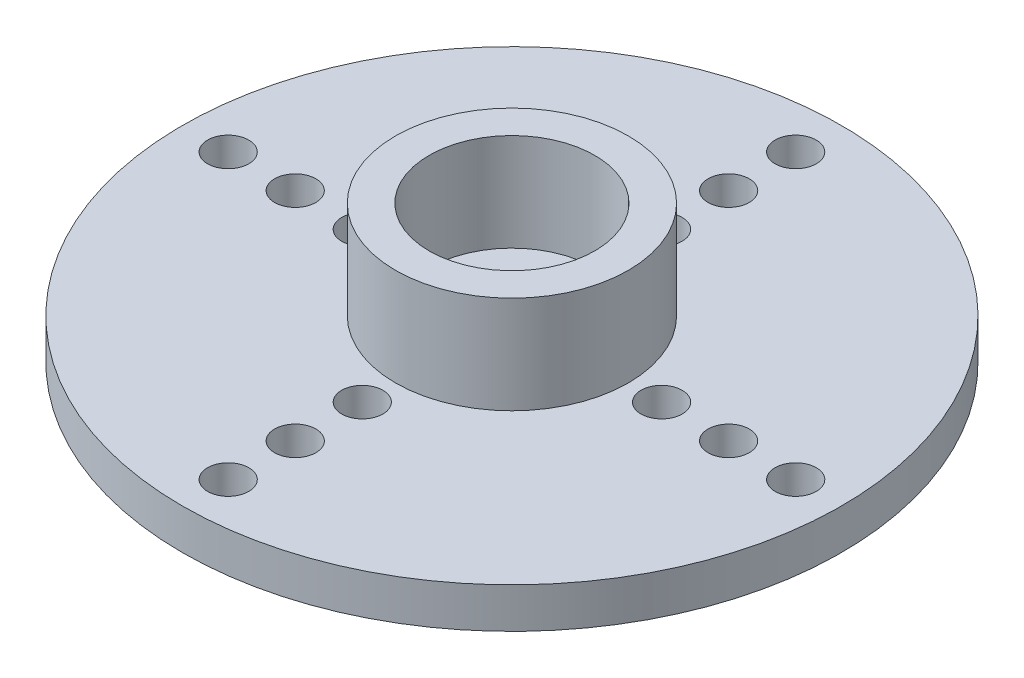
ISO-10303-21;
HEADER;
FILE_DESCRIPTION(('STEP AP214'),'2;1');
FILE_NAME('part.step','',(''),(''),'','','');
FILE_SCHEMA(('AUTOMOTIVE_DESIGN { 1 0 10303 214 1 1 1 1 }'));
ENDSEC;
DATA;
#1=APPLICATION_CONTEXT('core data for automotive mechanical design processes');
#2=APPLICATION_PROTOCOL_DEFINITION('international standard','automotive_design',2000,#1);
#3=PRODUCT_CONTEXT('',#1,'mechanical');
#4=PRODUCT('Part','Part','',(#3));
#5=PRODUCT_RELATED_PRODUCT_CATEGORY('part','',(#4));
#6=PRODUCT_DEFINITION_FORMATION('','',#4);
#7=PRODUCT_DEFINITION_CONTEXT('part definition',#1,'design');
#8=PRODUCT_DEFINITION('design','',#6,#7);
#9=PRODUCT_DEFINITION_SHAPE('','',#8);
#10=(LENGTH_UNIT() NAMED_UNIT(*) SI_UNIT(.MILLI.,.METRE.));
#11=(NAMED_UNIT(*) PLANE_ANGLE_UNIT() SI_UNIT($,.RADIAN.));
#12=(NAMED_UNIT(*) SI_UNIT($,.STERADIAN.) SOLID_ANGLE_UNIT());
#13=UNCERTAINTY_MEASURE_WITH_UNIT(LENGTH_MEASURE(1.E-05),#10,'distance_accuracy_value','');
#14=(GEOMETRIC_REPRESENTATION_CONTEXT(3) GLOBAL_UNCERTAINTY_ASSIGNED_CONTEXT((#13)) GLOBAL_UNIT_ASSIGNED_CONTEXT((#10,
#11,#12)) REPRESENTATION_CONTEXT('',''));
#15=CARTESIAN_POINT('',(0.,0.,0.));
#16=DIRECTION('',(0.,0.,1.));
#17=DIRECTION('',(1.,0.,0.));
#18=AXIS2_PLACEMENT_3D('',#15,#16,#17);
#19=CARTESIAN_POINT('',(0.,1.2192,0.));
#20=DIRECTION('',(0.,1.,0.));
#21=DIRECTION('',(0.,0.,1.));
#22=AXIS2_PLACEMENT_3D('',#19,#20,#21);
#23=PLANE('',#22);
#24=CARTESIAN_POINT('',(0.,1.2192,4.5212));
#25=DIRECTION('',(0.,1.,0.));
#26=DIRECTION('',(0.,0.,-1.));
#27=AXIS2_PLACEMENT_3D('',#24,#25,#26);
#28=CIRCLE('',#27,0.622300000000001);
#29=CARTESIAN_POINT('',(0.,1.2192,3.8989));
#30=VERTEX_POINT('',#29);
#31=EDGE_CURVE('E130',#30,#30,#28,.T.);
#32=ORIENTED_EDGE('',*,*,#31,.F.);
#33=EDGE_LOOP('',(#32));
#34=FACE_BOUND('',#33,.T.);
#35=CARTESIAN_POINT('',(0.,1.2192,6.54685));
#36=DIRECTION('',(0.,1.,0.));
#37=DIRECTION('',(0.,0.,-1.));
#38=AXIS2_PLACEMENT_3D('',#35,#36,#37);
#39=CIRCLE('',#38,0.622300000000001);
#40=CARTESIAN_POINT('',(0.,1.2192,5.92455));
#41=VERTEX_POINT('',#40);
#42=EDGE_CURVE('E124',#41,#41,#39,.T.);
#43=ORIENTED_EDGE('',*,*,#42,.F.);
#44=EDGE_LOOP('',(#43));
#45=FACE_BOUND('',#44,.T.);
#46=CARTESIAN_POINT('',(0.,1.2192,8.5725));
#47=DIRECTION('',(0.,1.,0.));
#48=DIRECTION('',(0.,0.,-1.));
#49=AXIS2_PLACEMENT_3D('',#46,#47,#48);
#50=CIRCLE('',#49,0.622299999999999);
#51=CARTESIAN_POINT('',(0.,1.2192,7.9502));
#52=VERTEX_POINT('',#51);
#53=EDGE_CURVE('E118',#52,#52,#50,.T.);
#54=ORIENTED_EDGE('',*,*,#53,.F.);
#55=EDGE_LOOP('',(#54));
#56=FACE_BOUND('',#55,.T.);
#57=CARTESIAN_POINT('',(0.,1.2192,-8.5725));
#58=DIRECTION('',(0.,1.,0.));
#59=DIRECTION('',(0.,0.,1.));
#60=AXIS2_PLACEMENT_3D('',#57,#58,#59);
#61=CIRCLE('',#60,0.622299999999999);
#62=CARTESIAN_POINT('',(0.,1.2192,-7.9502));
#63=VERTEX_POINT('',#62);
#64=EDGE_CURVE('E112',#63,#63,#61,.T.);
#65=ORIENTED_EDGE('',*,*,#64,.F.);
#66=EDGE_LOOP('',(#65));
#67=FACE_BOUND('',#66,.T.);
#68=CARTESIAN_POINT('',(0.,1.2192,-6.54685));
#69=DIRECTION('',(0.,1.,0.));
#70=DIRECTION('',(0.,0.,1.));
#71=AXIS2_PLACEMENT_3D('',#68,#69,#70);
#72=CIRCLE('',#71,0.6223);
#73=CARTESIAN_POINT('',(0.,1.2192,-5.92455));
#74=VERTEX_POINT('',#73);
#75=EDGE_CURVE('E106',#74,#74,#72,.T.);
#76=ORIENTED_EDGE('',*,*,#75,.F.);
#77=EDGE_LOOP('',(#76));
#78=FACE_BOUND('',#77,.T.);
#79=CARTESIAN_POINT('',(0.,1.2192,-4.5212));
#80=DIRECTION('',(0.,1.,0.));
#81=DIRECTION('',(0.,0.,1.));
#82=AXIS2_PLACEMENT_3D('',#79,#80,#81);
#83=CIRCLE('',#82,0.622300000000001);
#84=CARTESIAN_POINT('',(0.,1.2192,-3.8989));
#85=VERTEX_POINT('',#84);
#86=EDGE_CURVE('E100',#85,#85,#83,.T.);
#87=ORIENTED_EDGE('',*,*,#86,.F.);
#88=EDGE_LOOP('',(#87));
#89=FACE_BOUND('',#88,.T.);
#90=CARTESIAN_POINT('',(4.5212,1.2192,0.));
#91=DIRECTION('',(0.,1.,0.));
#92=DIRECTION('',(0.,0.,-1.));
#93=AXIS2_PLACEMENT_3D('',#90,#91,#92);
#94=CIRCLE('',#93,0.6223);
#95=CARTESIAN_POINT('',(4.5212,1.2192,-0.6223));
#96=VERTEX_POINT('',#95);
#97=EDGE_CURVE('E94',#96,#96,#94,.T.);
#98=ORIENTED_EDGE('',*,*,#97,.F.);
#99=EDGE_LOOP('',(#98));
#100=FACE_BOUND('',#99,.T.);
#101=CARTESIAN_POINT('',(6.54685,1.2192,0.));
#102=DIRECTION('',(0.,1.,0.));
#103=DIRECTION('',(0.,0.,-1.));
#104=AXIS2_PLACEMENT_3D('',#101,#102,#103);
#105=CIRCLE('',#104,0.6223);
#106=CARTESIAN_POINT('',(6.54685,1.2192,-0.622300000000001));
#107=VERTEX_POINT('',#106);
#108=EDGE_CURVE('E88',#107,#107,#105,.T.);
#109=ORIENTED_EDGE('',*,*,#108,.F.);
#110=EDGE_LOOP('',(#109));
#111=FACE_BOUND('',#110,.T.);
#112=CARTESIAN_POINT('',(8.5725,1.2192,0.));
#113=DIRECTION('',(0.,1.,0.));
#114=DIRECTION('',(0.,0.,-1.));
#115=AXIS2_PLACEMENT_3D('',#112,#113,#114);
#116=CIRCLE('',#115,0.622299999999999);
#117=CARTESIAN_POINT('',(8.5725,1.2192,-0.622300000000006));
#118=VERTEX_POINT('',#117);
#119=EDGE_CURVE('E82',#118,#118,#116,.T.);
#120=ORIENTED_EDGE('',*,*,#119,.F.);
#121=EDGE_LOOP('',(#120));
#122=FACE_BOUND('',#121,.T.);
#123=CARTESIAN_POINT('',(-8.5725,1.2192,0.));
#124=DIRECTION('',(0.,1.,0.));
#125=DIRECTION('',(0.,0.,1.));
#126=AXIS2_PLACEMENT_3D('',#123,#124,#125);
#127=CIRCLE('',#126,0.622299999999999);
#128=CARTESIAN_POINT('',(-8.5725,1.2192,0.6223));
#129=VERTEX_POINT('',#128);
#130=EDGE_CURVE('E76',#129,#129,#127,.T.);
#131=ORIENTED_EDGE('',*,*,#130,.F.);
#132=EDGE_LOOP('',(#131));
#133=FACE_BOUND('',#132,.T.);
#134=CARTESIAN_POINT('',(-6.54685,1.2192,0.));
#135=DIRECTION('',(0.,1.,0.));
#136=DIRECTION('',(0.,0.,1.));
#137=AXIS2_PLACEMENT_3D('',#134,#135,#136);
#138=CIRCLE('',#137,0.6223);
#139=CARTESIAN_POINT('',(-6.54685,1.2192,0.6223));
#140=VERTEX_POINT('',#139);
#141=EDGE_CURVE('E70',#140,#140,#138,.T.);
#142=ORIENTED_EDGE('',*,*,#141,.F.);
#143=EDGE_LOOP('',(#142));
#144=FACE_BOUND('',#143,.T.);
#145=CARTESIAN_POINT('',(-4.5212,1.2192,0.));
#146=DIRECTION('',(0.,1.,0.));
#147=DIRECTION('',(0.,0.,1.));
#148=AXIS2_PLACEMENT_3D('',#145,#146,#147);
#149=CIRCLE('',#148,0.6223);
#150=CARTESIAN_POINT('',(-4.5212,1.2192,0.6223));
#151=VERTEX_POINT('',#150);
#152=EDGE_CURVE('E64',#151,#151,#149,.T.);
#153=ORIENTED_EDGE('',*,*,#152,.F.);
#154=EDGE_LOOP('',(#153));
#155=FACE_BOUND('',#154,.T.);
#156=CARTESIAN_POINT('',(0.,1.2192,0.));
#157=DIRECTION('',(0.,1.,0.));
#158=DIRECTION('',(0.,0.,1.));
#159=AXIS2_PLACEMENT_3D('',#156,#157,#158);
#160=CIRCLE('',#159,9.9568);
#161=CARTESIAN_POINT('',(0.,1.2192,9.9568));
#162=VERTEX_POINT('',#161);
#163=EDGE_CURVE('E38',#162,#162,#160,.T.);
#164=ORIENTED_EDGE('',*,*,#163,.T.);
#165=EDGE_LOOP('',(#164));
#166=FACE_BOUND('',#165,.T.);
#167=CARTESIAN_POINT('',(0.,1.2192,0.));
#168=DIRECTION('',(0.,1.,0.));
#169=DIRECTION('',(0.,0.,1.));
#170=AXIS2_PLACEMENT_3D('',#167,#168,#169);
#171=CIRCLE('',#170,3.5179);
#172=CARTESIAN_POINT('',(0.,1.2192,3.5179));
#173=VERTEX_POINT('',#172);
#174=EDGE_CURVE('E49',#173,#173,#171,.T.);
#175=ORIENTED_EDGE('',*,*,#174,.F.);
#176=EDGE_LOOP('',(#175));
#177=FACE_BOUND('',#176,.T.);
#178=ADVANCED_FACE('F31',(#34,#45,#56,#67,#78,#89,#100,#111,#122,#133,#144,#155,#166,#177),#23,.T.);
#179=CARTESIAN_POINT('',(0.,1.2192,0.));
#180=DIRECTION('',(0.,-1.,0.));
#181=DIRECTION('',(0.,0.,-1.));
#182=AXIS2_PLACEMENT_3D('',#179,#180,#181);
#183=CYLINDRICAL_SURFACE('',#182,9.9568);
#184=ORIENTED_EDGE('',*,*,#163,.F.);
#185=EDGE_LOOP('',(#184));
#186=FACE_BOUND('',#185,.T.);
#187=CARTESIAN_POINT('',(0.,0.,0.));
#188=DIRECTION('',(0.,1.,0.));
#189=DIRECTION('',(0.,0.,1.));
#190=AXIS2_PLACEMENT_3D('',#187,#188,#189);
#191=CIRCLE('',#190,9.9568);
#192=CARTESIAN_POINT('',(0.,0.,9.9568));
#193=VERTEX_POINT('',#192);
#194=EDGE_CURVE('E42',#193,#193,#191,.T.);
#195=ORIENTED_EDGE('',*,*,#194,.T.);
#196=EDGE_LOOP('',(#195));
#197=FACE_BOUND('',#196,.T.);
#198=ADVANCED_FACE('F33',(#186,#197),#183,.T.);
#199=CARTESIAN_POINT('',(0.,0.,0.));
#200=DIRECTION('',(0.,1.,0.));
#201=DIRECTION('',(0.,0.,1.));
#202=AXIS2_PLACEMENT_3D('',#199,#200,#201);
#203=PLANE('',#202);
#204=CARTESIAN_POINT('',(0.,0.,4.5212));
#205=DIRECTION('',(0.,1.,0.));
#206=DIRECTION('',(0.,0.,-1.));
#207=AXIS2_PLACEMENT_3D('',#204,#205,#206);
#208=CIRCLE('',#207,0.622300000000001);
#209=CARTESIAN_POINT('',(0.,0.,3.8989));
#210=VERTEX_POINT('',#209);
#211=EDGE_CURVE('E127',#210,#210,#208,.T.);
#212=ORIENTED_EDGE('',*,*,#211,.T.);
#213=EDGE_LOOP('',(#212));
#214=FACE_BOUND('',#213,.T.);
#215=CARTESIAN_POINT('',(0.,0.,6.54685));
#216=DIRECTION('',(0.,1.,0.));
#217=DIRECTION('',(0.,0.,-1.));
#218=AXIS2_PLACEMENT_3D('',#215,#216,#217);
#219=CIRCLE('',#218,0.622300000000001);
#220=CARTESIAN_POINT('',(0.,0.,5.92455));
#221=VERTEX_POINT('',#220);
#222=EDGE_CURVE('E121',#221,#221,#219,.T.);
#223=ORIENTED_EDGE('',*,*,#222,.T.);
#224=EDGE_LOOP('',(#223));
#225=FACE_BOUND('',#224,.T.);
#226=CARTESIAN_POINT('',(0.,0.,8.5725));
#227=DIRECTION('',(0.,1.,0.));
#228=DIRECTION('',(0.,0.,-1.));
#229=AXIS2_PLACEMENT_3D('',#226,#227,#228);
#230=CIRCLE('',#229,0.622299999999999);
#231=CARTESIAN_POINT('',(0.,0.,7.9502));
#232=VERTEX_POINT('',#231);
#233=EDGE_CURVE('E115',#232,#232,#230,.T.);
#234=ORIENTED_EDGE('',*,*,#233,.T.);
#235=EDGE_LOOP('',(#234));
#236=FACE_BOUND('',#235,.T.);
#237=CARTESIAN_POINT('',(0.,0.,-8.5725));
#238=DIRECTION('',(0.,1.,0.));
#239=DIRECTION('',(0.,0.,1.));
#240=AXIS2_PLACEMENT_3D('',#237,#238,#239);
#241=CIRCLE('',#240,0.622299999999999);
#242=CARTESIAN_POINT('',(0.,0.,-7.9502));
#243=VERTEX_POINT('',#242);
#244=EDGE_CURVE('E109',#243,#243,#241,.T.);
#245=ORIENTED_EDGE('',*,*,#244,.T.);
#246=EDGE_LOOP('',(#245));
#247=FACE_BOUND('',#246,.T.);
#248=CARTESIAN_POINT('',(0.,0.,-6.54685));
#249=DIRECTION('',(0.,1.,0.));
#250=DIRECTION('',(0.,0.,1.));
#251=AXIS2_PLACEMENT_3D('',#248,#249,#250);
#252=CIRCLE('',#251,0.6223);
#253=CARTESIAN_POINT('',(0.,0.,-5.92455));
#254=VERTEX_POINT('',#253);
#255=EDGE_CURVE('E103',#254,#254,#252,.T.);
#256=ORIENTED_EDGE('',*,*,#255,.T.);
#257=EDGE_LOOP('',(#256));
#258=FACE_BOUND('',#257,.T.);
#259=CARTESIAN_POINT('',(0.,0.,-4.5212));
#260=DIRECTION('',(0.,1.,0.));
#261=DIRECTION('',(0.,0.,1.));
#262=AXIS2_PLACEMENT_3D('',#259,#260,#261);
#263=CIRCLE('',#262,0.622300000000001);
#264=CARTESIAN_POINT('',(0.,0.,-3.8989));
#265=VERTEX_POINT('',#264);
#266=EDGE_CURVE('E97',#265,#265,#263,.T.);
#267=ORIENTED_EDGE('',*,*,#266,.T.);
#268=EDGE_LOOP('',(#267));
#269=FACE_BOUND('',#268,.T.);
#270=CARTESIAN_POINT('',(4.5212,0.,0.));
#271=DIRECTION('',(0.,1.,0.));
#272=DIRECTION('',(0.,0.,-1.));
#273=AXIS2_PLACEMENT_3D('',#270,#271,#272);
#274=CIRCLE('',#273,0.6223);
#275=CARTESIAN_POINT('',(4.5212,0.,-0.6223));
#276=VERTEX_POINT('',#275);
#277=EDGE_CURVE('E91',#276,#276,#274,.T.);
#278=ORIENTED_EDGE('',*,*,#277,.T.);
#279=EDGE_LOOP('',(#278));
#280=FACE_BOUND('',#279,.T.);
#281=CARTESIAN_POINT('',(6.54685,0.,0.));
#282=DIRECTION('',(0.,1.,0.));
#283=DIRECTION('',(0.,0.,-1.));
#284=AXIS2_PLACEMENT_3D('',#281,#282,#283);
#285=CIRCLE('',#284,0.6223);
#286=CARTESIAN_POINT('',(6.54685,0.,-0.622300000000001));
#287=VERTEX_POINT('',#286);
#288=EDGE_CURVE('E85',#287,#287,#285,.T.);
#289=ORIENTED_EDGE('',*,*,#288,.T.);
#290=EDGE_LOOP('',(#289));
#291=FACE_BOUND('',#290,.T.);
#292=CARTESIAN_POINT('',(8.5725,0.,0.));
#293=DIRECTION('',(0.,1.,0.));
#294=DIRECTION('',(0.,0.,-1.));
#295=AXIS2_PLACEMENT_3D('',#292,#293,#294);
#296=CIRCLE('',#295,0.622299999999999);
#297=CARTESIAN_POINT('',(8.5725,0.,-0.622300000000006));
#298=VERTEX_POINT('',#297);
#299=EDGE_CURVE('E79',#298,#298,#296,.T.);
#300=ORIENTED_EDGE('',*,*,#299,.T.);
#301=EDGE_LOOP('',(#300));
#302=FACE_BOUND('',#301,.T.);
#303=CARTESIAN_POINT('',(-8.5725,0.,0.));
#304=DIRECTION('',(0.,1.,0.));
#305=DIRECTION('',(0.,0.,1.));
#306=AXIS2_PLACEMENT_3D('',#303,#304,#305);
#307=CIRCLE('',#306,0.622299999999999);
#308=CARTESIAN_POINT('',(-8.5725,0.,0.6223));
#309=VERTEX_POINT('',#308);
#310=EDGE_CURVE('E73',#309,#309,#307,.T.);
#311=ORIENTED_EDGE('',*,*,#310,.T.);
#312=EDGE_LOOP('',(#311));
#313=FACE_BOUND('',#312,.T.);
#314=CARTESIAN_POINT('',(-6.54685,0.,0.));
#315=DIRECTION('',(0.,1.,0.));
#316=DIRECTION('',(0.,0.,1.));
#317=AXIS2_PLACEMENT_3D('',#314,#315,#316);
#318=CIRCLE('',#317,0.6223);
#319=CARTESIAN_POINT('',(-6.54685,0.,0.6223));
#320=VERTEX_POINT('',#319);
#321=EDGE_CURVE('E67',#320,#320,#318,.T.);
#322=ORIENTED_EDGE('',*,*,#321,.T.);
#323=EDGE_LOOP('',(#322));
#324=FACE_BOUND('',#323,.T.);
#325=CARTESIAN_POINT('',(-4.5212,0.,0.));
#326=DIRECTION('',(0.,1.,0.));
#327=DIRECTION('',(0.,0.,1.));
#328=AXIS2_PLACEMENT_3D('',#325,#326,#327);
#329=CIRCLE('',#328,0.6223);
#330=CARTESIAN_POINT('',(-4.5212,0.,0.6223));
#331=VERTEX_POINT('',#330);
#332=EDGE_CURVE('E61',#331,#331,#329,.T.);
#333=ORIENTED_EDGE('',*,*,#332,.T.);
#334=EDGE_LOOP('',(#333));
#335=FACE_BOUND('',#334,.T.);
#336=CARTESIAN_POINT('',(0.,0.,0.));
#337=DIRECTION('',(0.,1.,0.));
#338=DIRECTION('',(0.,0.,1.));
#339=AXIS2_PLACEMENT_3D('',#336,#337,#338);
#340=CIRCLE('',#339,1.0795);
#341=CARTESIAN_POINT('',(0.,0.,1.0795));
#342=VERTEX_POINT('',#341);
#343=EDGE_CURVE('E57',#342,#342,#340,.T.);
#344=ORIENTED_EDGE('',*,*,#343,.T.);
#345=EDGE_LOOP('',(#344));
#346=FACE_BOUND('',#345,.T.);
#347=ORIENTED_EDGE('',*,*,#194,.F.);
#348=EDGE_LOOP('',(#347));
#349=FACE_BOUND('',#348,.T.);
#350=ADVANCED_FACE('F136',(#214,#225,#236,#247,#258,#269,#280,#291,#302,#313,#324,#335,#346,
#349),#203,.F.);
#351=CARTESIAN_POINT('',(0.,4.1656,0.));
#352=DIRECTION('',(0.,1.,0.));
#353=DIRECTION('',(0.,0.,1.));
#354=AXIS2_PLACEMENT_3D('',#351,#352,#353);
#355=PLANE('',#354);
#356=CARTESIAN_POINT('',(0.,4.1656,0.));
#357=DIRECTION('',(0.,1.,0.));
#358=DIRECTION('',(0.,0.,1.));
#359=AXIS2_PLACEMENT_3D('',#356,#357,#358);
#360=CIRCLE('',#359,3.5179);
#361=CARTESIAN_POINT('',(0.,4.1656,3.5179));
#362=VERTEX_POINT('',#361);
#363=EDGE_CURVE('E47',#362,#362,#360,.T.);
#364=ORIENTED_EDGE('',*,*,#363,.T.);
#365=EDGE_LOOP('',(#364));
#366=FACE_BOUND('',#365,.T.);
#367=CARTESIAN_POINT('',(0.,4.1656,0.));
#368=DIRECTION('',(0.,1.,0.));
#369=DIRECTION('',(0.,0.,1.));
#370=AXIS2_PLACEMENT_3D('',#367,#368,#369);
#371=CIRCLE('',#370,2.5019);
#372=CARTESIAN_POINT('',(0.,4.1656,2.5019));
#373=VERTEX_POINT('',#372);
#374=EDGE_CURVE('E52',#373,#373,#371,.T.);
#375=ORIENTED_EDGE('',*,*,#374,.F.);
#376=EDGE_LOOP('',(#375));
#377=FACE_BOUND('',#376,.T.);
#378=ADVANCED_FACE('F177',(#366,#377),#355,.T.);
#379=CARTESIAN_POINT('',(0.,4.1656,0.));
#380=DIRECTION('',(0.,-1.,0.));
#381=DIRECTION('',(0.,0.,-1.));
#382=AXIS2_PLACEMENT_3D('',#379,#380,#381);
#383=CYLINDRICAL_SURFACE('',#382,3.5179);
#384=ORIENTED_EDGE('',*,*,#363,.F.);
#385=EDGE_LOOP('',(#384));
#386=FACE_BOUND('',#385,.T.);
#387=ORIENTED_EDGE('',*,*,#174,.T.);
#388=EDGE_LOOP('',(#387));
#389=FACE_BOUND('',#388,.T.);
#390=ADVANCED_FACE('F174',(#386,#389),#383,.T.);
#391=CARTESIAN_POINT('',(0.,4.1656,0.));
#392=DIRECTION('',(0.,-1.,0.));
#393=DIRECTION('',(0.,0.,-1.));
#394=AXIS2_PLACEMENT_3D('',#391,#392,#393);
#395=CYLINDRICAL_SURFACE('',#394,2.5019);
#396=ORIENTED_EDGE('',*,*,#374,.T.);
#397=EDGE_LOOP('',(#396));
#398=FACE_BOUND('',#397,.T.);
#399=CARTESIAN_POINT('',(0.,1.2192,0.));
#400=DIRECTION('',(0.,1.,0.));
#401=DIRECTION('',(0.,0.,1.));
#402=AXIS2_PLACEMENT_3D('',#399,#400,#401);
#403=CIRCLE('',#402,2.5019);
#404=CARTESIAN_POINT('',(0.,1.2192,2.5019));
#405=VERTEX_POINT('',#404);
#406=EDGE_CURVE('E10',#405,#405,#403,.F.);
#407=ORIENTED_EDGE('',*,*,#406,.T.);
#408=EDGE_LOOP('',(#407));
#409=FACE_BOUND('',#408,.T.);
#410=ADVANCED_FACE('F176',(#398,#409),#395,.F.);
#411=CARTESIAN_POINT('',(0.,1.2192,0.));
#412=DIRECTION('',(0.,1.,0.));
#413=DIRECTION('',(0.,0.,1.));
#414=AXIS2_PLACEMENT_3D('',#411,#412,#413);
#415=CIRCLE('',#414,1.0795);
#416=CARTESIAN_POINT('',(0.,1.2192,1.0795));
#417=VERTEX_POINT('',#416);
#418=EDGE_CURVE('E58',#417,#417,#415,.T.);
#419=ORIENTED_EDGE('',*,*,#418,.F.);
#420=EDGE_LOOP('',(#419));
#421=FACE_BOUND('',#420,.T.);
#422=ORIENTED_EDGE('',*,*,#406,.F.);
#423=EDGE_LOOP('',(#422));
#424=FACE_BOUND('',#423,.T.);
#425=ADVANCED_FACE('F149',(#421,#424),#23,.T.);
#426=CARTESIAN_POINT('',(0.,0.,0.));
#427=DIRECTION('',(0.,1.,0.));
#428=DIRECTION('',(0.,0.,1.));
#429=AXIS2_PLACEMENT_3D('',#426,#427,#428);
#430=CYLINDRICAL_SURFACE('',#429,1.0795);
#431=ORIENTED_EDGE('',*,*,#343,.F.);
#432=EDGE_LOOP('',(#431));
#433=FACE_BOUND('',#432,.T.);
#434=ORIENTED_EDGE('',*,*,#418,.T.);
#435=EDGE_LOOP('',(#434));
#436=FACE_BOUND('',#435,.T.);
#437=ADVANCED_FACE('F190',(#433,#436),#430,.F.);
#438=CARTESIAN_POINT('',(-4.5212,0.,0.));
#439=DIRECTION('',(0.,1.,0.));
#440=DIRECTION('',(0.,0.,1.));
#441=AXIS2_PLACEMENT_3D('',#438,#439,#440);
#442=CYLINDRICAL_SURFACE('',#441,0.6223);
#443=ORIENTED_EDGE('',*,*,#332,.F.);
#444=EDGE_LOOP('',(#443));
#445=FACE_BOUND('',#444,.T.);
#446=ORIENTED_EDGE('',*,*,#152,.T.);
#447=EDGE_LOOP('',(#446));
#448=FACE_BOUND('',#447,.T.);
#449=ADVANCED_FACE('F230',(#445,#448),#442,.F.);
#450=CARTESIAN_POINT('',(-6.54685,0.,0.));
#451=DIRECTION('',(0.,1.,0.));
#452=DIRECTION('',(0.,0.,1.));
#453=AXIS2_PLACEMENT_3D('',#450,#451,#452);
#454=CYLINDRICAL_SURFACE('',#453,0.6223);
#455=ORIENTED_EDGE('',*,*,#321,.F.);
#456=EDGE_LOOP('',(#455));
#457=FACE_BOUND('',#456,.T.);
#458=ORIENTED_EDGE('',*,*,#141,.T.);
#459=EDGE_LOOP('',(#458));
#460=FACE_BOUND('',#459,.T.);
#461=ADVANCED_FACE('F240',(#457,#460),#454,.F.);
#462=CARTESIAN_POINT('',(-8.5725,0.,0.));
#463=DIRECTION('',(0.,1.,0.));
#464=DIRECTION('',(0.,0.,1.));
#465=AXIS2_PLACEMENT_3D('',#462,#463,#464);
#466=CYLINDRICAL_SURFACE('',#465,0.622299999999999);
#467=ORIENTED_EDGE('',*,*,#310,.F.);
#468=EDGE_LOOP('',(#467));
#469=FACE_BOUND('',#468,.T.);
#470=ORIENTED_EDGE('',*,*,#130,.T.);
#471=EDGE_LOOP('',(#470));
#472=FACE_BOUND('',#471,.T.);
#473=ADVANCED_FACE('F250',(#469,#472),#466,.F.);
#474=CARTESIAN_POINT('',(8.5725,0.,0.));
#475=DIRECTION('',(0.,1.,0.));
#476=DIRECTION('',(0.,0.,1.));
#477=AXIS2_PLACEMENT_3D('',#474,#475,#476);
#478=CYLINDRICAL_SURFACE('',#477,0.622299999999999);
#479=ORIENTED_EDGE('',*,*,#299,.F.);
#480=EDGE_LOOP('',(#479));
#481=FACE_BOUND('',#480,.T.);
#482=ORIENTED_EDGE('',*,*,#119,.T.);
#483=EDGE_LOOP('',(#482));
#484=FACE_BOUND('',#483,.T.);
#485=ADVANCED_FACE('F260',(#481,#484),#478,.F.);
#486=CARTESIAN_POINT('',(6.54685,0.,0.));
#487=DIRECTION('',(0.,1.,0.));
#488=DIRECTION('',(0.,0.,1.));
#489=AXIS2_PLACEMENT_3D('',#486,#487,#488);
#490=CYLINDRICAL_SURFACE('',#489,0.6223);
#491=ORIENTED_EDGE('',*,*,#288,.F.);
#492=EDGE_LOOP('',(#491));
#493=FACE_BOUND('',#492,.T.);
#494=ORIENTED_EDGE('',*,*,#108,.T.);
#495=EDGE_LOOP('',(#494));
#496=FACE_BOUND('',#495,.T.);
#497=ADVANCED_FACE('F270',(#493,#496),#490,.F.);
#498=CARTESIAN_POINT('',(4.5212,0.,0.));
#499=DIRECTION('',(0.,1.,0.));
#500=DIRECTION('',(0.,0.,1.));
#501=AXIS2_PLACEMENT_3D('',#498,#499,#500);
#502=CYLINDRICAL_SURFACE('',#501,0.6223);
#503=ORIENTED_EDGE('',*,*,#277,.F.);
#504=EDGE_LOOP('',(#503));
#505=FACE_BOUND('',#504,.T.);
#506=ORIENTED_EDGE('',*,*,#97,.T.);
#507=EDGE_LOOP('',(#506));
#508=FACE_BOUND('',#507,.T.);
#509=ADVANCED_FACE('F280',(#505,#508),#502,.F.);
#510=CARTESIAN_POINT('',(0.,0.,-4.5212));
#511=DIRECTION('',(0.,1.,0.));
#512=DIRECTION('',(0.,0.,1.));
#513=AXIS2_PLACEMENT_3D('',#510,#511,#512);
#514=CYLINDRICAL_SURFACE('',#513,0.622300000000001);
#515=ORIENTED_EDGE('',*,*,#266,.F.);
#516=EDGE_LOOP('',(#515));
#517=FACE_BOUND('',#516,.T.);
#518=ORIENTED_EDGE('',*,*,#86,.T.);
#519=EDGE_LOOP('',(#518));
#520=FACE_BOUND('',#519,.T.);
#521=ADVANCED_FACE('F290',(#517,#520),#514,.F.);
#522=CARTESIAN_POINT('',(0.,0.,-6.54685));
#523=DIRECTION('',(0.,1.,0.));
#524=DIRECTION('',(0.,0.,1.));
#525=AXIS2_PLACEMENT_3D('',#522,#523,#524);
#526=CYLINDRICAL_SURFACE('',#525,0.6223);
#527=ORIENTED_EDGE('',*,*,#255,.F.);
#528=EDGE_LOOP('',(#527));
#529=FACE_BOUND('',#528,.T.);
#530=ORIENTED_EDGE('',*,*,#75,.T.);
#531=EDGE_LOOP('',(#530));
#532=FACE_BOUND('',#531,.T.);
#533=ADVANCED_FACE('F300',(#529,#532),#526,.F.);
#534=CARTESIAN_POINT('',(0.,0.,-8.5725));
#535=DIRECTION('',(0.,1.,0.));
#536=DIRECTION('',(0.,0.,1.));
#537=AXIS2_PLACEMENT_3D('',#534,#535,#536);
#538=CYLINDRICAL_SURFACE('',#537,0.622299999999999);
#539=ORIENTED_EDGE('',*,*,#244,.F.);
#540=EDGE_LOOP('',(#539));
#541=FACE_BOUND('',#540,.T.);
#542=ORIENTED_EDGE('',*,*,#64,.T.);
#543=EDGE_LOOP('',(#542));
#544=FACE_BOUND('',#543,.T.);
#545=ADVANCED_FACE('F310',(#541,#544),#538,.F.);
#546=CARTESIAN_POINT('',(0.,0.,8.5725));
#547=DIRECTION('',(0.,1.,0.));
#548=DIRECTION('',(0.,0.,1.));
#549=AXIS2_PLACEMENT_3D('',#546,#547,#548);
#550=CYLINDRICAL_SURFACE('',#549,0.622299999999999);
#551=ORIENTED_EDGE('',*,*,#233,.F.);
#552=EDGE_LOOP('',(#551));
#553=FACE_BOUND('',#552,.T.);
#554=ORIENTED_EDGE('',*,*,#53,.T.);
#555=EDGE_LOOP('',(#554));
#556=FACE_BOUND('',#555,.T.);
#557=ADVANCED_FACE('F320',(#553,#556),#550,.F.);
#558=CARTESIAN_POINT('',(0.,0.,6.54685));
#559=DIRECTION('',(0.,1.,0.));
#560=DIRECTION('',(0.,0.,1.));
#561=AXIS2_PLACEMENT_3D('',#558,#559,#560);
#562=CYLINDRICAL_SURFACE('',#561,0.622300000000001);
#563=ORIENTED_EDGE('',*,*,#222,.F.);
#564=EDGE_LOOP('',(#563));
#565=FACE_BOUND('',#564,.T.);
#566=ORIENTED_EDGE('',*,*,#42,.T.);
#567=EDGE_LOOP('',(#566));
#568=FACE_BOUND('',#567,.T.);
#569=ADVANCED_FACE('F142',(#565,#568),#562,.F.);
#570=CARTESIAN_POINT('',(0.,0.,4.5212));
#571=DIRECTION('',(0.,1.,0.));
#572=DIRECTION('',(0.,0.,1.));
#573=AXIS2_PLACEMENT_3D('',#570,#571,#572);
#574=CYLINDRICAL_SURFACE('',#573,0.622300000000001);
#575=ORIENTED_EDGE('',*,*,#211,.F.);
#576=EDGE_LOOP('',(#575));
#577=FACE_BOUND('',#576,.T.);
#578=ORIENTED_EDGE('',*,*,#31,.T.);
#579=EDGE_LOOP('',(#578));
#580=FACE_BOUND('',#579,.T.);
#581=ADVANCED_FACE('F139',(#577,#580),#574,.F.);
#582=CLOSED_SHELL('',(#178,#198,#350,#378,#390,#410,#425,#437,#449,#461,#473,#485,#497,#509,
#521,#533,#545,#557,#569,#581));
#583=MANIFOLD_SOLID_BREP('B2',#582);
#584=ADVANCED_BREP_SHAPE_REPRESENTATION('',(#18,#583),#14);
#585=SHAPE_DEFINITION_REPRESENTATION(#9,#584);
ENDSEC;
END-ISO-10303-21;
